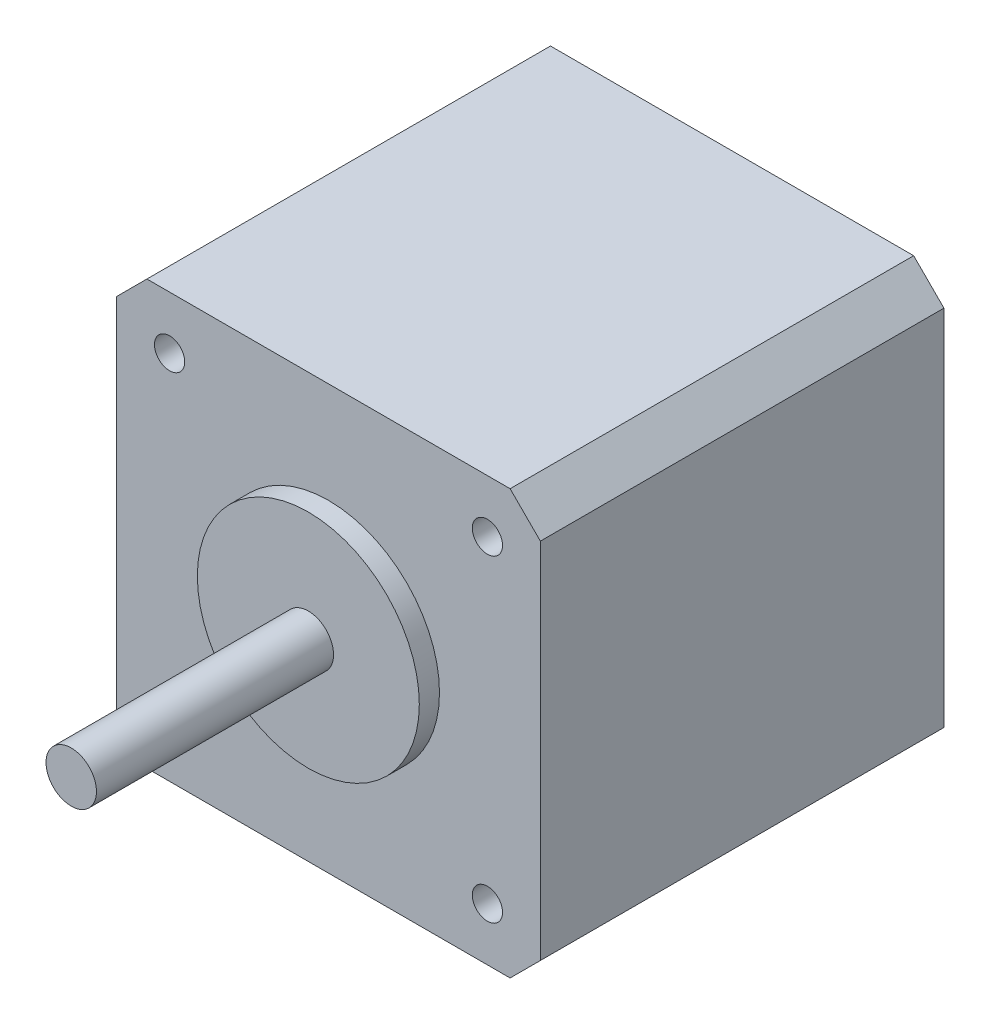
ISO-10303-21;
HEADER;
FILE_DESCRIPTION(('STEP AP214'),'2;1');
FILE_NAME('part.step','',(''),(''),'','','');
FILE_SCHEMA(('AUTOMOTIVE_DESIGN { 1 0 10303 214 1 1 1 1 }'));
ENDSEC;
DATA;
#1=APPLICATION_CONTEXT('core data for automotive mechanical design processes');
#2=APPLICATION_PROTOCOL_DEFINITION('international standard','automotive_design',2000,#1);
#3=PRODUCT_CONTEXT('',#1,'mechanical');
#4=PRODUCT('Part','Part','',(#3));
#5=PRODUCT_RELATED_PRODUCT_CATEGORY('part','',(#4));
#6=PRODUCT_DEFINITION_FORMATION('','',#4);
#7=PRODUCT_DEFINITION_CONTEXT('part definition',#1,'design');
#8=PRODUCT_DEFINITION('design','',#6,#7);
#9=PRODUCT_DEFINITION_SHAPE('','',#8);
#10=(LENGTH_UNIT() NAMED_UNIT(*) SI_UNIT(.MILLI.,.METRE.));
#11=(NAMED_UNIT(*) PLANE_ANGLE_UNIT() SI_UNIT($,.RADIAN.));
#12=(NAMED_UNIT(*) SI_UNIT($,.STERADIAN.) SOLID_ANGLE_UNIT());
#13=UNCERTAINTY_MEASURE_WITH_UNIT(LENGTH_MEASURE(1.E-05),#10,'distance_accuracy_value','');
#14=(GEOMETRIC_REPRESENTATION_CONTEXT(3) GLOBAL_UNCERTAINTY_ASSIGNED_CONTEXT((#13)) GLOBAL_UNIT_ASSIGNED_CONTEXT((#10,
#11,#12)) REPRESENTATION_CONTEXT('',''));
#15=CARTESIAN_POINT('',(0.,0.,0.));
#16=DIRECTION('',(0.,0.,1.));
#17=DIRECTION('',(1.,0.,0.));
#18=AXIS2_PLACEMENT_3D('',#15,#16,#17);
#19=CARTESIAN_POINT('',(0.,0.,42.));
#20=DIRECTION('',(0.,0.,1.));
#21=DIRECTION('',(1.,0.,0.));
#22=AXIS2_PLACEMENT_3D('',#19,#20,#21);
#23=PLANE('',#22);
#24=CARTESIAN_POINT('',(0.,0.,42.));
#25=DIRECTION('',(0.,0.,1.));
#26=DIRECTION('',(1.,0.,0.));
#27=AXIS2_PLACEMENT_3D('',#24,#25,#26);
#28=CIRCLE('',#27,11.);
#29=CARTESIAN_POINT('',(11.,0.,42.));
#30=VERTEX_POINT('',#29);
#31=EDGE_CURVE('E162',#30,#30,#28,.T.);
#32=ORIENTED_EDGE('',*,*,#31,.T.);
#33=EDGE_LOOP('',(#32));
#34=FACE_BOUND('',#33,.T.);
#35=CARTESIAN_POINT('',(0.,0.,42.));
#36=DIRECTION('',(0.,0.,1.));
#37=DIRECTION('',(1.,0.,0.));
#38=AXIS2_PLACEMENT_3D('',#35,#36,#37);
#39=CIRCLE('',#38,2.5);
#40=CARTESIAN_POINT('',(2.5,0.,42.));
#41=VERTEX_POINT('',#40);
#42=EDGE_CURVE('E176',#41,#41,#39,.T.);
#43=ORIENTED_EDGE('',*,*,#42,.F.);
#44=EDGE_LOOP('',(#43));
#45=FACE_BOUND('',#44,.T.);
#46=ADVANCED_FACE('F32',(#34,#45),#23,.T.);
#47=CARTESIAN_POINT('',(0.,0.,40.));
#48=DIRECTION('',(0.,0.,1.));
#49=DIRECTION('',(1.,0.,0.));
#50=AXIS2_PLACEMENT_3D('',#47,#48,#49);
#51=PLANE('',#50);
#52=CARTESIAN_POINT('',(15.75,-15.75,40.));
#53=DIRECTION('',(0.,0.,1.));
#54=DIRECTION('',(1.,0.,0.));
#55=AXIS2_PLACEMENT_3D('',#52,#53,#54);
#56=CIRCLE('',#55,1.5);
#57=CARTESIAN_POINT('',(17.25,-15.75,40.));
#58=VERTEX_POINT('',#57);
#59=EDGE_CURVE('E200',#58,#58,#56,.T.);
#60=ORIENTED_EDGE('',*,*,#59,.F.);
#61=EDGE_LOOP('',(#60));
#62=FACE_BOUND('',#61,.T.);
#63=CARTESIAN_POINT('',(-15.75,-15.75,40.));
#64=DIRECTION('',(0.,0.,1.));
#65=DIRECTION('',(1.,0.,0.));
#66=AXIS2_PLACEMENT_3D('',#63,#64,#65);
#67=CIRCLE('',#66,1.5);
#68=CARTESIAN_POINT('',(-14.25,-15.75,40.));
#69=VERTEX_POINT('',#68);
#70=EDGE_CURVE('E194',#69,#69,#67,.T.);
#71=ORIENTED_EDGE('',*,*,#70,.F.);
#72=EDGE_LOOP('',(#71));
#73=FACE_BOUND('',#72,.T.);
#74=CARTESIAN_POINT('',(15.75,15.75,40.));
#75=DIRECTION('',(0.,0.,1.));
#76=DIRECTION('',(1.,0.,0.));
#77=AXIS2_PLACEMENT_3D('',#74,#75,#76);
#78=CIRCLE('',#77,1.5);
#79=CARTESIAN_POINT('',(17.25,15.75,40.));
#80=VERTEX_POINT('',#79);
#81=EDGE_CURVE('E188',#80,#80,#78,.T.);
#82=ORIENTED_EDGE('',*,*,#81,.F.);
#83=EDGE_LOOP('',(#82));
#84=FACE_BOUND('',#83,.T.);
#85=CARTESIAN_POINT('',(-15.75,15.75,40.));
#86=DIRECTION('',(0.,0.,1.));
#87=DIRECTION('',(1.,0.,0.));
#88=AXIS2_PLACEMENT_3D('',#85,#86,#87);
#89=CIRCLE('',#88,1.5);
#90=CARTESIAN_POINT('',(-14.25,15.75,40.));
#91=VERTEX_POINT('',#90);
#92=EDGE_CURVE('E182',#91,#91,#89,.T.);
#93=ORIENTED_EDGE('',*,*,#92,.F.);
#94=EDGE_LOOP('',(#93));
#95=FACE_BOUND('',#94,.T.);
#96=DIRECTION('',(0.,-1.,0.));
#97=VECTOR('',#96,1.);
#98=CARTESIAN_POINT('',(-21.,21.,40.));
#99=LINE('',#98,#97);
#100=CARTESIAN_POINT('',(-21.,18.,40.));
#101=VERTEX_POINT('',#100);
#102=CARTESIAN_POINT('',(-21.,-18.,40.));
#103=VERTEX_POINT('',#102);
#104=EDGE_CURVE('E169',#101,#103,#99,.T.);
#105=ORIENTED_EDGE('',*,*,#104,.T.);
#106=DIRECTION('',(-0.707106781186544,0.707106781186551,0.));
#107=VECTOR('',#106,1.);
#108=CARTESIAN_POINT('',(-19.5000000000001,-19.4999999999999,40.));
#109=LINE('',#108,#107);
#110=CARTESIAN_POINT('',(-18.,-21.,40.));
#111=VERTEX_POINT('',#110);
#112=EDGE_CURVE('E146',#103,#111,#109,.F.);
#113=ORIENTED_EDGE('',*,*,#112,.T.);
#114=DIRECTION('',(1.,0.,0.));
#115=VECTOR('',#114,1.);
#116=CARTESIAN_POINT('',(-21.,-21.,40.));
#117=LINE('',#116,#115);
#118=CARTESIAN_POINT('',(18.,-21.,40.));
#119=VERTEX_POINT('',#118);
#120=EDGE_CURVE('E118',#111,#119,#117,.T.);
#121=ORIENTED_EDGE('',*,*,#120,.T.);
#122=DIRECTION('',(-0.707106781186549,-0.707106781186546,0.));
#123=VECTOR('',#122,1.);
#124=CARTESIAN_POINT('',(19.5,-19.5000000000001,40.));
#125=LINE('',#124,#123);
#126=CARTESIAN_POINT('',(21.,-18.,40.));
#127=VERTEX_POINT('',#126);
#128=EDGE_CURVE('E144',#119,#127,#125,.F.);
#129=ORIENTED_EDGE('',*,*,#128,.T.);
#130=DIRECTION('',(0.,1.,0.));
#131=VECTOR('',#130,1.);
#132=CARTESIAN_POINT('',(21.,21.,40.));
#133=LINE('',#132,#131);
#134=CARTESIAN_POINT('',(21.,18.,40.));
#135=VERTEX_POINT('',#134);
#136=EDGE_CURVE('E124',#127,#135,#133,.T.);
#137=ORIENTED_EDGE('',*,*,#136,.T.);
#138=DIRECTION('',(0.707106781186544,-0.707106781186551,0.));
#139=VECTOR('',#138,1.);
#140=CARTESIAN_POINT('',(19.5000000000001,19.4999999999999,40.));
#141=LINE('',#140,#139);
#142=CARTESIAN_POINT('',(18.,21.,40.));
#143=VERTEX_POINT('',#142);
#144=EDGE_CURVE('E53',#135,#143,#141,.F.);
#145=ORIENTED_EDGE('',*,*,#144,.T.);
#146=DIRECTION('',(-1.,0.,0.));
#147=VECTOR('',#146,1.);
#148=CARTESIAN_POINT('',(-21.,21.,40.));
#149=LINE('',#148,#147);
#150=CARTESIAN_POINT('',(-18.,21.,40.));
#151=VERTEX_POINT('',#150);
#152=EDGE_CURVE('E127',#143,#151,#149,.T.);
#153=ORIENTED_EDGE('',*,*,#152,.T.);
#154=DIRECTION('',(0.707106781186549,0.707106781186546,0.));
#155=VECTOR('',#154,1.);
#156=CARTESIAN_POINT('',(-19.5,19.5000000000001,40.));
#157=LINE('',#156,#155);
#158=EDGE_CURVE('E141',#151,#101,#157,.F.);
#159=ORIENTED_EDGE('',*,*,#158,.T.);
#160=EDGE_LOOP('',(#105,#113,#121,#129,#137,#145,#153,#159));
#161=FACE_BOUND('',#160,.T.);
#162=CARTESIAN_POINT('',(0.,0.,40.));
#163=DIRECTION('',(0.,0.,1.));
#164=DIRECTION('',(1.,0.,0.));
#165=AXIS2_PLACEMENT_3D('',#162,#163,#164);
#166=CIRCLE('',#165,11.);
#167=CARTESIAN_POINT('',(11.,0.,40.));
#168=VERTEX_POINT('',#167);
#169=EDGE_CURVE('E165',#168,#168,#166,.T.);
#170=ORIENTED_EDGE('',*,*,#169,.F.);
#171=EDGE_LOOP('',(#170));
#172=FACE_BOUND('',#171,.T.);
#173=ADVANCED_FACE('F215',(#62,#73,#84,#95,#161,#172),#51,.T.);
#174=CARTESIAN_POINT('',(21.,21.,40.));
#175=DIRECTION('',(-1.,0.,0.));
#176=DIRECTION('',(0.,-1.,0.));
#177=AXIS2_PLACEMENT_3D('',#174,#175,#176);
#178=PLANE('',#177);
#179=ORIENTED_EDGE('',*,*,#136,.F.);
#180=DIRECTION('',(0.,0.,-1.));
#181=VECTOR('',#180,1.);
#182=CARTESIAN_POINT('',(21.,-18.,40.));
#183=LINE('',#182,#181);
#184=CARTESIAN_POINT('',(21.,-18.,0.));
#185=VERTEX_POINT('',#184);
#186=EDGE_CURVE('E150',#127,#185,#183,.T.);
#187=ORIENTED_EDGE('',*,*,#186,.T.);
#188=DIRECTION('',(0.,1.,0.));
#189=VECTOR('',#188,1.);
#190=CARTESIAN_POINT('',(21.,21.,0.));
#191=LINE('',#190,#189);
#192=CARTESIAN_POINT('',(21.,18.,0.));
#193=VERTEX_POINT('',#192);
#194=EDGE_CURVE('E157',#185,#193,#191,.T.);
#195=ORIENTED_EDGE('',*,*,#194,.T.);
#196=DIRECTION('',(0.,0.,1.));
#197=VECTOR('',#196,1.);
#198=CARTESIAN_POINT('',(21.,18.,40.));
#199=LINE('',#198,#197);
#200=EDGE_CURVE('E148',#193,#135,#199,.T.);
#201=ORIENTED_EDGE('',*,*,#200,.T.);
#202=EDGE_LOOP('',(#179,#187,#195,#201));
#203=FACE_BOUND('',#202,.T.);
#204=ADVANCED_FACE('F156',(#203),#178,.F.);
#205=CARTESIAN_POINT('',(-21.,21.,40.));
#206=DIRECTION('',(0.,-1.,0.));
#207=DIRECTION('',(0.,0.,-1.));
#208=AXIS2_PLACEMENT_3D('',#205,#206,#207);
#209=PLANE('',#208);
#210=ORIENTED_EDGE('',*,*,#152,.F.);
#211=DIRECTION('',(0.,0.,-1.));
#212=VECTOR('',#211,1.);
#213=CARTESIAN_POINT('',(18.,21.,40.));
#214=LINE('',#213,#212);
#215=CARTESIAN_POINT('',(18.,21.,0.));
#216=VERTEX_POINT('',#215);
#217=EDGE_CURVE('E11',#143,#216,#214,.T.);
#218=ORIENTED_EDGE('',*,*,#217,.T.);
#219=DIRECTION('',(-1.,0.,0.));
#220=VECTOR('',#219,1.);
#221=CARTESIAN_POINT('',(-21.,21.,0.));
#222=LINE('',#221,#220);
#223=CARTESIAN_POINT('',(-18.,21.,0.));
#224=VERTEX_POINT('',#223);
#225=EDGE_CURVE('E129',#216,#224,#222,.T.);
#226=ORIENTED_EDGE('',*,*,#225,.T.);
#227=DIRECTION('',(0.,0.,1.));
#228=VECTOR('',#227,1.);
#229=CARTESIAN_POINT('',(-18.,21.,40.));
#230=LINE('',#229,#228);
#231=EDGE_CURVE('E40',#224,#151,#230,.T.);
#232=ORIENTED_EDGE('',*,*,#231,.T.);
#233=EDGE_LOOP('',(#210,#218,#226,#232));
#234=FACE_BOUND('',#233,.T.);
#235=ADVANCED_FACE('F377',(#234),#209,.F.);
#236=CARTESIAN_POINT('',(-21.,21.,40.));
#237=DIRECTION('',(1.,0.,0.));
#238=DIRECTION('',(0.,1.,0.));
#239=AXIS2_PLACEMENT_3D('',#236,#237,#238);
#240=PLANE('',#239);
#241=DIRECTION('',(0.,-1.,0.));
#242=VECTOR('',#241,1.);
#243=CARTESIAN_POINT('',(-21.,21.,0.));
#244=LINE('',#243,#242);
#245=CARTESIAN_POINT('',(-21.,18.,0.));
#246=VERTEX_POINT('',#245);
#247=CARTESIAN_POINT('',(-21.,-18.,0.));
#248=VERTEX_POINT('',#247);
#249=EDGE_CURVE('E125',#246,#248,#244,.T.);
#250=ORIENTED_EDGE('',*,*,#249,.T.);
#251=DIRECTION('',(0.,0.,1.));
#252=VECTOR('',#251,1.);
#253=CARTESIAN_POINT('',(-21.,-18.,40.));
#254=LINE('',#253,#252);
#255=EDGE_CURVE('E103',#248,#103,#254,.T.);
#256=ORIENTED_EDGE('',*,*,#255,.T.);
#257=ORIENTED_EDGE('',*,*,#104,.F.);
#258=DIRECTION('',(0.,0.,-1.));
#259=VECTOR('',#258,1.);
#260=CARTESIAN_POINT('',(-21.,18.,40.));
#261=LINE('',#260,#259);
#262=EDGE_CURVE('E108',#101,#246,#261,.T.);
#263=ORIENTED_EDGE('',*,*,#262,.T.);
#264=EDGE_LOOP('',(#250,#256,#257,#263));
#265=FACE_BOUND('',#264,.T.);
#266=ADVANCED_FACE('F369',(#265),#240,.F.);
#267=CARTESIAN_POINT('',(-21.,-21.,40.));
#268=DIRECTION('',(0.,1.,0.));
#269=DIRECTION('',(0.,0.,1.));
#270=AXIS2_PLACEMENT_3D('',#267,#268,#269);
#271=PLANE('',#270);
#272=ORIENTED_EDGE('',*,*,#120,.F.);
#273=DIRECTION('',(0.,0.,-1.));
#274=VECTOR('',#273,1.);
#275=CARTESIAN_POINT('',(-18.,-21.,40.));
#276=LINE('',#275,#274);
#277=CARTESIAN_POINT('',(-18.,-21.,0.));
#278=VERTEX_POINT('',#277);
#279=EDGE_CURVE('E102',#111,#278,#276,.T.);
#280=ORIENTED_EDGE('',*,*,#279,.T.);
#281=DIRECTION('',(1.,0.,0.));
#282=VECTOR('',#281,1.);
#283=CARTESIAN_POINT('',(-21.,-21.,0.));
#284=LINE('',#283,#282);
#285=CARTESIAN_POINT('',(18.,-21.,0.));
#286=VERTEX_POINT('',#285);
#287=EDGE_CURVE('E115',#278,#286,#284,.T.);
#288=ORIENTED_EDGE('',*,*,#287,.T.);
#289=DIRECTION('',(0.,0.,1.));
#290=VECTOR('',#289,1.);
#291=CARTESIAN_POINT('',(18.,-21.,40.));
#292=LINE('',#291,#290);
#293=EDGE_CURVE('E120',#286,#119,#292,.T.);
#294=ORIENTED_EDGE('',*,*,#293,.T.);
#295=EDGE_LOOP('',(#272,#280,#288,#294));
#296=FACE_BOUND('',#295,.T.);
#297=ADVANCED_FACE('F114',(#296),#271,.F.);
#298=CARTESIAN_POINT('',(0.,0.,0.));
#299=DIRECTION('',(0.,0.,1.));
#300=DIRECTION('',(1.,0.,0.));
#301=AXIS2_PLACEMENT_3D('',#298,#299,#300);
#302=PLANE('',#301);
#303=ORIENTED_EDGE('',*,*,#287,.F.);
#304=DIRECTION('',(0.707106781186544,-0.707106781186551,0.));
#305=VECTOR('',#304,1.);
#306=CARTESIAN_POINT('',(-18.,-21.,0.));
#307=LINE('',#306,#305);
#308=EDGE_CURVE('E98',#278,#248,#307,.F.);
#309=ORIENTED_EDGE('',*,*,#308,.T.);
#310=ORIENTED_EDGE('',*,*,#249,.F.);
#311=DIRECTION('',(-0.707106781186549,-0.707106781186546,0.));
#312=VECTOR('',#311,1.);
#313=CARTESIAN_POINT('',(-21.,18.,0.));
#314=LINE('',#313,#312);
#315=EDGE_CURVE('E119',#246,#224,#314,.F.);
#316=ORIENTED_EDGE('',*,*,#315,.T.);
#317=ORIENTED_EDGE('',*,*,#225,.F.);
#318=DIRECTION('',(-0.707106781186544,0.707106781186551,0.));
#319=VECTOR('',#318,1.);
#320=CARTESIAN_POINT('',(18.,21.,0.));
#321=LINE('',#320,#319);
#322=EDGE_CURVE('E135',#216,#193,#321,.F.);
#323=ORIENTED_EDGE('',*,*,#322,.T.);
#324=ORIENTED_EDGE('',*,*,#194,.F.);
#325=DIRECTION('',(0.707106781186549,0.707106781186546,0.));
#326=VECTOR('',#325,1.);
#327=CARTESIAN_POINT('',(21.,-18.,0.));
#328=LINE('',#327,#326);
#329=EDGE_CURVE('E109',#185,#286,#328,.F.);
#330=ORIENTED_EDGE('',*,*,#329,.T.);
#331=EDGE_LOOP('',(#303,#309,#310,#316,#317,#323,#324,#330));
#332=FACE_BOUND('',#331,.T.);
#333=ADVANCED_FACE('F122',(#332),#302,.F.);
#334=CARTESIAN_POINT('',(0.,0.,42.));
#335=DIRECTION('',(0.,0.,-1.));
#336=DIRECTION('',(-1.,0.,0.));
#337=AXIS2_PLACEMENT_3D('',#334,#335,#336);
#338=CYLINDRICAL_SURFACE('',#337,11.);
#339=ORIENTED_EDGE('',*,*,#31,.F.);
#340=EDGE_LOOP('',(#339));
#341=FACE_BOUND('',#340,.T.);
#342=ORIENTED_EDGE('',*,*,#169,.T.);
#343=EDGE_LOOP('',(#342));
#344=FACE_BOUND('',#343,.T.);
#345=ADVANCED_FACE('F228',(#341,#344),#338,.T.);
#346=CARTESIAN_POINT('',(0.,0.,65.5));
#347=DIRECTION('',(0.,0.,-1.));
#348=DIRECTION('',(-1.,0.,0.));
#349=AXIS2_PLACEMENT_3D('',#346,#347,#348);
#350=CYLINDRICAL_SURFACE('',#349,2.5);
#351=CARTESIAN_POINT('',(0.,0.,65.5));
#352=DIRECTION('',(0.,0.,1.));
#353=DIRECTION('',(1.,0.,0.));
#354=AXIS2_PLACEMENT_3D('',#351,#352,#353);
#355=CIRCLE('',#354,2.5);
#356=CARTESIAN_POINT('',(2.5,0.,65.5));
#357=VERTEX_POINT('',#356);
#358=EDGE_CURVE('E174',#357,#357,#355,.T.);
#359=ORIENTED_EDGE('',*,*,#358,.F.);
#360=EDGE_LOOP('',(#359));
#361=FACE_BOUND('',#360,.T.);
#362=ORIENTED_EDGE('',*,*,#42,.T.);
#363=EDGE_LOOP('',(#362));
#364=FACE_BOUND('',#363,.T.);
#365=ADVANCED_FACE('F230',(#361,#364),#350,.T.);
#366=CARTESIAN_POINT('',(0.,0.,65.5));
#367=DIRECTION('',(0.,0.,1.));
#368=DIRECTION('',(1.,0.,0.));
#369=AXIS2_PLACEMENT_3D('',#366,#367,#368);
#370=PLANE('',#369);
#371=ORIENTED_EDGE('',*,*,#358,.T.);
#372=EDGE_LOOP('',(#371));
#373=FACE_BOUND('',#372,.T.);
#374=ADVANCED_FACE('F237',(#373),#370,.T.);
#375=CARTESIAN_POINT('',(-18.,-21.,40.));
#376=DIRECTION('',(0.707106781186551,0.707106781186544,0.));
#377=DIRECTION('',(0.,0.,-1.));
#378=AXIS2_PLACEMENT_3D('',#375,#376,#377);
#379=PLANE('',#378);
#380=ORIENTED_EDGE('',*,*,#112,.F.);
#381=ORIENTED_EDGE('',*,*,#255,.F.);
#382=ORIENTED_EDGE('',*,*,#308,.F.);
#383=ORIENTED_EDGE('',*,*,#279,.F.);
#384=EDGE_LOOP('',(#380,#381,#382,#383));
#385=FACE_BOUND('',#384,.T.);
#386=ADVANCED_FACE('F101',(#385),#379,.F.);
#387=CARTESIAN_POINT('',(21.,-18.,40.));
#388=DIRECTION('',(-0.707106781186546,0.707106781186549,0.));
#389=DIRECTION('',(0.,0.,-1.));
#390=AXIS2_PLACEMENT_3D('',#387,#388,#389);
#391=PLANE('',#390);
#392=ORIENTED_EDGE('',*,*,#128,.F.);
#393=ORIENTED_EDGE('',*,*,#293,.F.);
#394=ORIENTED_EDGE('',*,*,#329,.F.);
#395=ORIENTED_EDGE('',*,*,#186,.F.);
#396=EDGE_LOOP('',(#392,#393,#394,#395));
#397=FACE_BOUND('',#396,.T.);
#398=ADVANCED_FACE('F320',(#397),#391,.F.);
#399=CARTESIAN_POINT('',(18.,21.,40.));
#400=DIRECTION('',(-0.707106781186551,-0.707106781186544,0.));
#401=DIRECTION('',(0.,0.,-1.));
#402=AXIS2_PLACEMENT_3D('',#399,#400,#401);
#403=PLANE('',#402);
#404=ORIENTED_EDGE('',*,*,#144,.F.);
#405=ORIENTED_EDGE('',*,*,#200,.F.);
#406=ORIENTED_EDGE('',*,*,#322,.F.);
#407=ORIENTED_EDGE('',*,*,#217,.F.);
#408=EDGE_LOOP('',(#404,#405,#406,#407));
#409=FACE_BOUND('',#408,.T.);
#410=ADVANCED_FACE('F313',(#409),#403,.F.);
#411=CARTESIAN_POINT('',(-21.,18.,40.));
#412=DIRECTION('',(0.707106781186546,-0.707106781186549,0.));
#413=DIRECTION('',(0.,0.,-1.));
#414=AXIS2_PLACEMENT_3D('',#411,#412,#413);
#415=PLANE('',#414);
#416=ORIENTED_EDGE('',*,*,#158,.F.);
#417=ORIENTED_EDGE('',*,*,#231,.F.);
#418=ORIENTED_EDGE('',*,*,#315,.F.);
#419=ORIENTED_EDGE('',*,*,#262,.F.);
#420=EDGE_LOOP('',(#416,#417,#418,#419));
#421=FACE_BOUND('',#420,.T.);
#422=ADVANCED_FACE('F34',(#421),#415,.F.);
#423=CARTESIAN_POINT('',(-15.75,15.75,30.));
#424=DIRECTION('',(0.,0.,1.));
#425=DIRECTION('',(1.,0.,0.));
#426=AXIS2_PLACEMENT_3D('',#423,#424,#425);
#427=CYLINDRICAL_SURFACE('',#426,1.5);
#428=CARTESIAN_POINT('',(-15.75,15.75,30.));
#429=DIRECTION('',(0.,0.,1.));
#430=DIRECTION('',(1.,0.,0.));
#431=AXIS2_PLACEMENT_3D('',#428,#429,#430);
#432=CIRCLE('',#431,1.5);
#433=CARTESIAN_POINT('',(-14.25,15.75,30.));
#434=VERTEX_POINT('',#433);
#435=EDGE_CURVE('E179',#434,#434,#432,.T.);
#436=ORIENTED_EDGE('',*,*,#435,.F.);
#437=EDGE_LOOP('',(#436));
#438=FACE_BOUND('',#437,.T.);
#439=ORIENTED_EDGE('',*,*,#92,.T.);
#440=EDGE_LOOP('',(#439));
#441=FACE_BOUND('',#440,.T.);
#442=ADVANCED_FACE('F252',(#438,#441),#427,.F.);
#443=CARTESIAN_POINT('',(-15.75,15.75,30.));
#444=DIRECTION('',(0.,0.,1.));
#445=DIRECTION('',(1.,0.,0.));
#446=AXIS2_PLACEMENT_3D('',#443,#444,#445);
#447=PLANE('',#446);
#448=ORIENTED_EDGE('',*,*,#435,.T.);
#449=EDGE_LOOP('',(#448));
#450=FACE_BOUND('',#449,.T.);
#451=ADVANCED_FACE('F255',(#450),#447,.T.);
#452=CARTESIAN_POINT('',(15.75,15.75,30.));
#453=DIRECTION('',(0.,0.,1.));
#454=DIRECTION('',(1.,0.,0.));
#455=AXIS2_PLACEMENT_3D('',#452,#453,#454);
#456=CYLINDRICAL_SURFACE('',#455,1.5);
#457=CARTESIAN_POINT('',(15.75,15.75,30.));
#458=DIRECTION('',(0.,0.,1.));
#459=DIRECTION('',(1.,0.,0.));
#460=AXIS2_PLACEMENT_3D('',#457,#458,#459);
#461=CIRCLE('',#460,1.5);
#462=CARTESIAN_POINT('',(17.25,15.75,30.));
#463=VERTEX_POINT('',#462);
#464=EDGE_CURVE('E185',#463,#463,#461,.T.);
#465=ORIENTED_EDGE('',*,*,#464,.F.);
#466=EDGE_LOOP('',(#465));
#467=FACE_BOUND('',#466,.T.);
#468=ORIENTED_EDGE('',*,*,#81,.T.);
#469=EDGE_LOOP('',(#468));
#470=FACE_BOUND('',#469,.T.);
#471=ADVANCED_FACE('F259',(#467,#470),#456,.F.);
#472=CARTESIAN_POINT('',(15.75,15.75,30.));
#473=DIRECTION('',(0.,0.,1.));
#474=DIRECTION('',(1.,0.,0.));
#475=AXIS2_PLACEMENT_3D('',#472,#473,#474);
#476=PLANE('',#475);
#477=ORIENTED_EDGE('',*,*,#464,.T.);
#478=EDGE_LOOP('',(#477));
#479=FACE_BOUND('',#478,.T.);
#480=ADVANCED_FACE('F263',(#479),#476,.T.);
#481=CARTESIAN_POINT('',(-15.75,-15.75,30.));
#482=DIRECTION('',(0.,0.,1.));
#483=DIRECTION('',(1.,0.,0.));
#484=AXIS2_PLACEMENT_3D('',#481,#482,#483);
#485=CYLINDRICAL_SURFACE('',#484,1.5);
#486=CARTESIAN_POINT('',(-15.75,-15.75,30.));
#487=DIRECTION('',(0.,0.,1.));
#488=DIRECTION('',(1.,0.,0.));
#489=AXIS2_PLACEMENT_3D('',#486,#487,#488);
#490=CIRCLE('',#489,1.5);
#491=CARTESIAN_POINT('',(-14.25,-15.75,30.));
#492=VERTEX_POINT('',#491);
#493=EDGE_CURVE('E191',#492,#492,#490,.T.);
#494=ORIENTED_EDGE('',*,*,#493,.F.);
#495=EDGE_LOOP('',(#494));
#496=FACE_BOUND('',#495,.T.);
#497=ORIENTED_EDGE('',*,*,#70,.T.);
#498=EDGE_LOOP('',(#497));
#499=FACE_BOUND('',#498,.T.);
#500=ADVANCED_FACE('F267',(#496,#499),#485,.F.);
#501=CARTESIAN_POINT('',(-15.75,-15.75,30.));
#502=DIRECTION('',(0.,0.,1.));
#503=DIRECTION('',(1.,0.,0.));
#504=AXIS2_PLACEMENT_3D('',#501,#502,#503);
#505=PLANE('',#504);
#506=ORIENTED_EDGE('',*,*,#493,.T.);
#507=EDGE_LOOP('',(#506));
#508=FACE_BOUND('',#507,.T.);
#509=ADVANCED_FACE('F211',(#508),#505,.T.);
#510=CARTESIAN_POINT('',(15.75,-15.75,30.));
#511=DIRECTION('',(0.,0.,1.));
#512=DIRECTION('',(1.,0.,0.));
#513=AXIS2_PLACEMENT_3D('',#510,#511,#512);
#514=CYLINDRICAL_SURFACE('',#513,1.5);
#515=CARTESIAN_POINT('',(15.75,-15.75,30.));
#516=DIRECTION('',(0.,0.,1.));
#517=DIRECTION('',(1.,0.,0.));
#518=AXIS2_PLACEMENT_3D('',#515,#516,#517);
#519=CIRCLE('',#518,1.5);
#520=CARTESIAN_POINT('',(17.25,-15.75,30.));
#521=VERTEX_POINT('',#520);
#522=EDGE_CURVE('E197',#521,#521,#519,.T.);
#523=ORIENTED_EDGE('',*,*,#522,.F.);
#524=EDGE_LOOP('',(#523));
#525=FACE_BOUND('',#524,.T.);
#526=ORIENTED_EDGE('',*,*,#59,.T.);
#527=EDGE_LOOP('',(#526));
#528=FACE_BOUND('',#527,.T.);
#529=ADVANCED_FACE('F208',(#525,#528),#514,.F.);
#530=CARTESIAN_POINT('',(15.75,-15.75,30.));
#531=DIRECTION('',(0.,0.,1.));
#532=DIRECTION('',(1.,0.,0.));
#533=AXIS2_PLACEMENT_3D('',#530,#531,#532);
#534=PLANE('',#533);
#535=ORIENTED_EDGE('',*,*,#522,.T.);
#536=EDGE_LOOP('',(#535));
#537=FACE_BOUND('',#536,.T.);
#538=ADVANCED_FACE('F206',(#537),#534,.T.);
#539=CLOSED_SHELL('',(#46,#173,#204,#235,#266,#297,#333,#345,#365,#374,#386,#398,#410,#422,#442,
#451,#471,#480,#500,#509,#529,#538));
#540=MANIFOLD_SOLID_BREP('B2',#539);
#541=ADVANCED_BREP_SHAPE_REPRESENTATION('',(#18,#540),#14);
#542=SHAPE_DEFINITION_REPRESENTATION(#9,#541);
ENDSEC;
END-ISO-10303-21;
